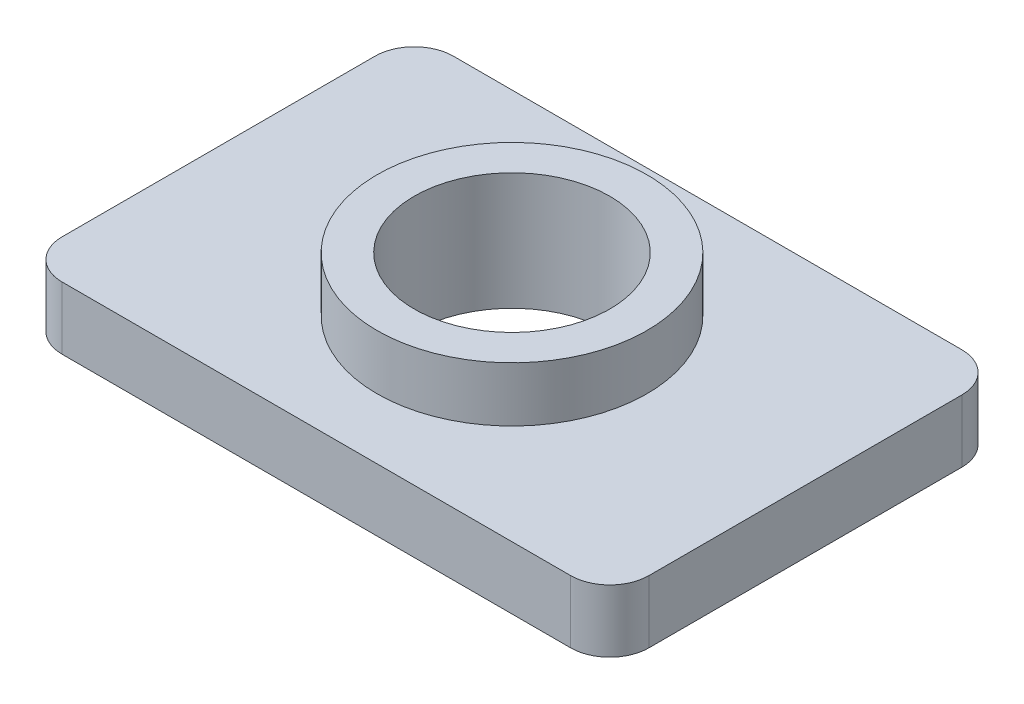
ISO-10303-21;
HEADER;
FILE_DESCRIPTION(('STEP AP214'),'2;1');
FILE_NAME('part.step','',(''),(''),'','','');
FILE_SCHEMA(('AUTOMOTIVE_DESIGN { 1 0 10303 214 1 1 1 1 }'));
ENDSEC;
DATA;
#1=APPLICATION_CONTEXT('core data for automotive mechanical design processes');
#2=APPLICATION_PROTOCOL_DEFINITION('international standard','automotive_design',2000,#1);
#3=PRODUCT_CONTEXT('',#1,'mechanical');
#4=PRODUCT('Part','Part','',(#3));
#5=PRODUCT_RELATED_PRODUCT_CATEGORY('part','',(#4));
#6=PRODUCT_DEFINITION_FORMATION('','',#4);
#7=PRODUCT_DEFINITION_CONTEXT('part definition',#1,'design');
#8=PRODUCT_DEFINITION('design','',#6,#7);
#9=PRODUCT_DEFINITION_SHAPE('','',#8);
#10=(LENGTH_UNIT() NAMED_UNIT(*) SI_UNIT(.MILLI.,.METRE.));
#11=(NAMED_UNIT(*) PLANE_ANGLE_UNIT() SI_UNIT($,.RADIAN.));
#12=(NAMED_UNIT(*) SI_UNIT($,.STERADIAN.) SOLID_ANGLE_UNIT());
#13=UNCERTAINTY_MEASURE_WITH_UNIT(LENGTH_MEASURE(1.E-05),#10,'distance_accuracy_value','');
#14=(GEOMETRIC_REPRESENTATION_CONTEXT(3) GLOBAL_UNCERTAINTY_ASSIGNED_CONTEXT((#13)) GLOBAL_UNIT_ASSIGNED_CONTEXT((#10,
#11,#12)) REPRESENTATION_CONTEXT('',''));
#15=CARTESIAN_POINT('',(0.,0.,0.));
#16=DIRECTION('',(0.,0.,1.));
#17=DIRECTION('',(1.,0.,0.));
#18=AXIS2_PLACEMENT_3D('',#15,#16,#17);
#19=CARTESIAN_POINT('',(0.,1.6,0.));
#20=DIRECTION('',(0.,1.,0.));
#21=DIRECTION('',(0.,0.,1.));
#22=AXIS2_PLACEMENT_3D('',#19,#20,#21);
#23=CYLINDRICAL_SURFACE('',#22,3.45);
#24=CARTESIAN_POINT('',(0.,3.,0.));
#25=DIRECTION('',(0.,1.,0.));
#26=DIRECTION('',(0.,0.,1.));
#27=AXIS2_PLACEMENT_3D('',#24,#25,#26);
#28=CIRCLE('',#27,3.45);
#29=CARTESIAN_POINT('',(0.,3.,3.45));
#30=VERTEX_POINT('',#29);
#31=EDGE_CURVE('E98',#30,#30,#28,.T.);
#32=ORIENTED_EDGE('',*,*,#31,.F.);
#33=EDGE_LOOP('',(#32));
#34=FACE_BOUND('',#33,.T.);
#35=CARTESIAN_POINT('',(0.,1.6,0.));
#36=DIRECTION('',(0.,1.,0.));
#37=DIRECTION('',(0.,0.,1.));
#38=AXIS2_PLACEMENT_3D('',#35,#36,#37);
#39=CIRCLE('',#38,3.45);
#40=CARTESIAN_POINT('',(0.,1.6,3.45));
#41=VERTEX_POINT('',#40);
#42=EDGE_CURVE('E19',#41,#41,#39,.F.);
#43=ORIENTED_EDGE('',*,*,#42,.F.);
#44=EDGE_LOOP('',(#43));
#45=FACE_BOUND('',#44,.T.);
#46=ADVANCED_FACE('F16',(#34,#45),#23,.T.);
#47=CARTESIAN_POINT('',(0.,1.6,0.));
#48=DIRECTION('',(0.,1.,0.));
#49=DIRECTION('',(0.,0.,1.));
#50=AXIS2_PLACEMENT_3D('',#47,#48,#49);
#51=PLANE('',#50);
#52=ORIENTED_EDGE('',*,*,#42,.T.);
#53=EDGE_LOOP('',(#52));
#54=FACE_BOUND('',#53,.T.);
#55=DIRECTION('',(1.,0.,0.));
#56=VECTOR('',#55,1.);
#57=CARTESIAN_POINT('',(-7.5,1.6,5.));
#58=LINE('',#57,#56);
#59=CARTESIAN_POINT('',(6.5,1.6,5.));
#60=VERTEX_POINT('',#59);
#61=CARTESIAN_POINT('',(-6.5,1.6,5.));
#62=VERTEX_POINT('',#61);
#63=EDGE_CURVE('E94',#60,#62,#58,.F.);
#64=ORIENTED_EDGE('',*,*,#63,.F.);
#65=CARTESIAN_POINT('',(6.5,1.6,4.));
#66=DIRECTION('',(0.,-1.,0.));
#67=DIRECTION('',(0.,0.,-1.));
#68=AXIS2_PLACEMENT_3D('',#65,#66,#67);
#69=CIRCLE('',#68,1.);
#70=CARTESIAN_POINT('',(7.5,1.6,4.));
#71=VERTEX_POINT('',#70);
#72=EDGE_CURVE('E88',#71,#60,#69,.T.);
#73=ORIENTED_EDGE('',*,*,#72,.F.);
#74=DIRECTION('',(0.,0.,-1.));
#75=VECTOR('',#74,1.);
#76=CARTESIAN_POINT('',(7.5,1.6,5.));
#77=LINE('',#76,#75);
#78=CARTESIAN_POINT('',(7.5,1.6,-4.));
#79=VERTEX_POINT('',#78);
#80=EDGE_CURVE('E78',#79,#71,#77,.F.);
#81=ORIENTED_EDGE('',*,*,#80,.F.);
#82=CARTESIAN_POINT('',(6.5,1.6,-4.));
#83=DIRECTION('',(0.,-1.,0.));
#84=DIRECTION('',(0.,0.,-1.));
#85=AXIS2_PLACEMENT_3D('',#82,#83,#84);
#86=CIRCLE('',#85,1.);
#87=CARTESIAN_POINT('',(6.5,1.6,-5.));
#88=VERTEX_POINT('',#87);
#89=EDGE_CURVE('E103',#88,#79,#86,.T.);
#90=ORIENTED_EDGE('',*,*,#89,.F.);
#91=DIRECTION('',(-1.,0.,0.));
#92=VECTOR('',#91,1.);
#93=CARTESIAN_POINT('',(7.5,1.6,-5.));
#94=LINE('',#93,#92);
#95=CARTESIAN_POINT('',(-6.5,1.6,-5.));
#96=VERTEX_POINT('',#95);
#97=EDGE_CURVE('E115',#96,#88,#94,.F.);
#98=ORIENTED_EDGE('',*,*,#97,.F.);
#99=CARTESIAN_POINT('',(-6.5,1.6,-4.));
#100=DIRECTION('',(0.,-1.,0.));
#101=DIRECTION('',(0.,0.,-1.));
#102=AXIS2_PLACEMENT_3D('',#99,#100,#101);
#103=CIRCLE('',#102,1.);
#104=CARTESIAN_POINT('',(-7.5,1.6,-4.));
#105=VERTEX_POINT('',#104);
#106=EDGE_CURVE('E137',#105,#96,#103,.T.);
#107=ORIENTED_EDGE('',*,*,#106,.F.);
#108=DIRECTION('',(0.,0.,1.));
#109=VECTOR('',#108,1.);
#110=CARTESIAN_POINT('',(-7.5,1.6,-5.));
#111=LINE('',#110,#109);
#112=CARTESIAN_POINT('',(-7.5,1.6,4.));
#113=VERTEX_POINT('',#112);
#114=EDGE_CURVE('E111',#113,#105,#111,.F.);
#115=ORIENTED_EDGE('',*,*,#114,.F.);
#116=CARTESIAN_POINT('',(-6.5,1.6,4.));
#117=DIRECTION('',(0.,-1.,0.));
#118=DIRECTION('',(0.,0.,-1.));
#119=AXIS2_PLACEMENT_3D('',#116,#117,#118);
#120=CIRCLE('',#119,1.);
#121=EDGE_CURVE('E135',#62,#113,#120,.T.);
#122=ORIENTED_EDGE('',*,*,#121,.F.);
#123=EDGE_LOOP('',(#64,#73,#81,#90,#98,#107,#115,#122));
#124=FACE_BOUND('',#123,.T.);
#125=ADVANCED_FACE('F92',(#54,#124),#51,.T.);
#126=CARTESIAN_POINT('',(0.,3.,0.));
#127=DIRECTION('',(0.,1.,0.));
#128=DIRECTION('',(0.,0.,1.));
#129=AXIS2_PLACEMENT_3D('',#126,#127,#128);
#130=PLANE('',#129);
#131=CARTESIAN_POINT('',(0.,3.,0.));
#132=DIRECTION('',(0.,-1.,0.));
#133=DIRECTION('',(0.,0.,-1.));
#134=AXIS2_PLACEMENT_3D('',#131,#132,#133);
#135=CIRCLE('',#134,2.5);
#136=CARTESIAN_POINT('',(0.,3.,-2.5));
#137=VERTEX_POINT('',#136);
#138=EDGE_CURVE('E131',#137,#137,#135,.T.);
#139=ORIENTED_EDGE('',*,*,#138,.T.);
#140=EDGE_LOOP('',(#139));
#141=FACE_BOUND('',#140,.T.);
#142=ORIENTED_EDGE('',*,*,#31,.T.);
#143=EDGE_LOOP('',(#142));
#144=FACE_BOUND('',#143,.T.);
#145=ADVANCED_FACE('F151',(#141,#144),#130,.T.);
#146=CARTESIAN_POINT('',(6.5,3.68576,4.));
#147=DIRECTION('',(0.,-1.,0.));
#148=DIRECTION('',(0.,0.,-1.));
#149=AXIS2_PLACEMENT_3D('',#146,#147,#148);
#150=CYLINDRICAL_SURFACE('',#149,1.);
#151=DIRECTION('',(0.,1.,0.));
#152=VECTOR('',#151,1.);
#153=CARTESIAN_POINT('',(6.5,0.,5.));
#154=LINE('',#153,#152);
#155=CARTESIAN_POINT('',(6.5,0.,5.));
#156=VERTEX_POINT('',#155);
#157=EDGE_CURVE('E134',#156,#60,#154,.T.);
#158=ORIENTED_EDGE('',*,*,#157,.F.);
#159=CARTESIAN_POINT('',(6.5,0.,4.));
#160=DIRECTION('',(0.,-1.,0.));
#161=DIRECTION('',(0.,0.,-1.));
#162=AXIS2_PLACEMENT_3D('',#159,#160,#161);
#163=CIRCLE('',#162,1.);
#164=CARTESIAN_POINT('',(7.5,0.,4.));
#165=VERTEX_POINT('',#164);
#166=EDGE_CURVE('E102',#156,#165,#163,.F.);
#167=ORIENTED_EDGE('',*,*,#166,.T.);
#168=DIRECTION('',(0.,1.,0.));
#169=VECTOR('',#168,1.);
#170=CARTESIAN_POINT('',(7.5,0.,4.));
#171=LINE('',#170,#169);
#172=EDGE_CURVE('E83',#71,#165,#171,.F.);
#173=ORIENTED_EDGE('',*,*,#172,.F.);
#174=ORIENTED_EDGE('',*,*,#72,.T.);
#175=EDGE_LOOP('',(#158,#167,#173,#174));
#176=FACE_BOUND('',#175,.T.);
#177=ADVANCED_FACE('F101',(#176),#150,.T.);
#178=CARTESIAN_POINT('',(7.5,0.,5.));
#179=DIRECTION('',(1.,0.,0.));
#180=DIRECTION('',(0.,0.,-1.));
#181=AXIS2_PLACEMENT_3D('',#178,#179,#180);
#182=PLANE('',#181);
#183=ORIENTED_EDGE('',*,*,#80,.T.);
#184=ORIENTED_EDGE('',*,*,#172,.T.);
#185=DIRECTION('',(0.,0.,1.));
#186=VECTOR('',#185,1.);
#187=CARTESIAN_POINT('',(7.5,0.,0.));
#188=LINE('',#187,#186);
#189=CARTESIAN_POINT('',(7.5,0.,-4.));
#190=VERTEX_POINT('',#189);
#191=EDGE_CURVE('E129',#165,#190,#188,.F.);
#192=ORIENTED_EDGE('',*,*,#191,.T.);
#193=DIRECTION('',(0.,-1.,0.));
#194=VECTOR('',#193,1.);
#195=CARTESIAN_POINT('',(7.5,3.68576,-4.));
#196=LINE('',#195,#194);
#197=EDGE_CURVE('E85',#79,#190,#196,.T.);
#198=ORIENTED_EDGE('',*,*,#197,.F.);
#199=EDGE_LOOP('',(#183,#184,#192,#198));
#200=FACE_BOUND('',#199,.T.);
#201=ADVANCED_FACE('F80',(#200),#182,.T.);
#202=CARTESIAN_POINT('',(6.5,3.68576,-4.));
#203=DIRECTION('',(0.,-1.,0.));
#204=DIRECTION('',(0.,0.,-1.));
#205=AXIS2_PLACEMENT_3D('',#202,#203,#204);
#206=CYLINDRICAL_SURFACE('',#205,1.);
#207=ORIENTED_EDGE('',*,*,#197,.T.);
#208=CARTESIAN_POINT('',(6.5,0.,-4.));
#209=DIRECTION('',(0.,-1.,0.));
#210=DIRECTION('',(0.,0.,-1.));
#211=AXIS2_PLACEMENT_3D('',#208,#209,#210);
#212=CIRCLE('',#211,1.);
#213=CARTESIAN_POINT('',(6.5,0.,-5.));
#214=VERTEX_POINT('',#213);
#215=EDGE_CURVE('E126',#190,#214,#212,.F.);
#216=ORIENTED_EDGE('',*,*,#215,.T.);
#217=DIRECTION('',(0.,1.,0.));
#218=VECTOR('',#217,1.);
#219=CARTESIAN_POINT('',(6.5,0.,-5.));
#220=LINE('',#219,#218);
#221=EDGE_CURVE('E116',#88,#214,#220,.F.);
#222=ORIENTED_EDGE('',*,*,#221,.F.);
#223=ORIENTED_EDGE('',*,*,#89,.T.);
#224=EDGE_LOOP('',(#207,#216,#222,#223));
#225=FACE_BOUND('',#224,.T.);
#226=ADVANCED_FACE('F183',(#225),#206,.T.);
#227=CARTESIAN_POINT('',(7.5,0.,-5.));
#228=DIRECTION('',(0.,0.,-1.));
#229=DIRECTION('',(-1.,0.,0.));
#230=AXIS2_PLACEMENT_3D('',#227,#228,#229);
#231=PLANE('',#230);
#232=ORIENTED_EDGE('',*,*,#97,.T.);
#233=ORIENTED_EDGE('',*,*,#221,.T.);
#234=DIRECTION('',(1.,0.,0.));
#235=VECTOR('',#234,1.);
#236=CARTESIAN_POINT('',(0.,0.,-5.));
#237=LINE('',#236,#235);
#238=CARTESIAN_POINT('',(-6.5,0.,-5.));
#239=VERTEX_POINT('',#238);
#240=EDGE_CURVE('E125',#214,#239,#237,.F.);
#241=ORIENTED_EDGE('',*,*,#240,.T.);
#242=DIRECTION('',(0.,-1.,0.));
#243=VECTOR('',#242,1.);
#244=CARTESIAN_POINT('',(-6.5,3.68576,-5.));
#245=LINE('',#244,#243);
#246=EDGE_CURVE('E114',#96,#239,#245,.T.);
#247=ORIENTED_EDGE('',*,*,#246,.F.);
#248=EDGE_LOOP('',(#232,#233,#241,#247));
#249=FACE_BOUND('',#248,.T.);
#250=ADVANCED_FACE('F179',(#249),#231,.T.);
#251=CARTESIAN_POINT('',(-6.5,3.68576,-4.));
#252=DIRECTION('',(0.,-1.,0.));
#253=DIRECTION('',(0.,0.,-1.));
#254=AXIS2_PLACEMENT_3D('',#251,#252,#253);
#255=CYLINDRICAL_SURFACE('',#254,1.);
#256=ORIENTED_EDGE('',*,*,#246,.T.);
#257=CARTESIAN_POINT('',(-6.5,0.,-4.));
#258=DIRECTION('',(0.,-1.,0.));
#259=DIRECTION('',(0.,0.,-1.));
#260=AXIS2_PLACEMENT_3D('',#257,#258,#259);
#261=CIRCLE('',#260,1.);
#262=CARTESIAN_POINT('',(-7.5,0.,-4.));
#263=VERTEX_POINT('',#262);
#264=EDGE_CURVE('E122',#239,#263,#261,.F.);
#265=ORIENTED_EDGE('',*,*,#264,.T.);
#266=DIRECTION('',(0.,1.,0.));
#267=VECTOR('',#266,1.);
#268=CARTESIAN_POINT('',(-7.5,0.,-4.));
#269=LINE('',#268,#267);
#270=EDGE_CURVE('E113',#105,#263,#269,.F.);
#271=ORIENTED_EDGE('',*,*,#270,.F.);
#272=ORIENTED_EDGE('',*,*,#106,.T.);
#273=EDGE_LOOP('',(#256,#265,#271,#272));
#274=FACE_BOUND('',#273,.T.);
#275=ADVANCED_FACE('F175',(#274),#255,.T.);
#276=CARTESIAN_POINT('',(-7.5,0.,-5.));
#277=DIRECTION('',(-1.,0.,0.));
#278=DIRECTION('',(0.,0.,1.));
#279=AXIS2_PLACEMENT_3D('',#276,#277,#278);
#280=PLANE('',#279);
#281=ORIENTED_EDGE('',*,*,#114,.T.);
#282=ORIENTED_EDGE('',*,*,#270,.T.);
#283=DIRECTION('',(0.,0.,1.));
#284=VECTOR('',#283,1.);
#285=CARTESIAN_POINT('',(-7.5,0.,0.));
#286=LINE('',#285,#284);
#287=CARTESIAN_POINT('',(-7.5,0.,4.));
#288=VERTEX_POINT('',#287);
#289=EDGE_CURVE('E121',#263,#288,#286,.T.);
#290=ORIENTED_EDGE('',*,*,#289,.T.);
#291=DIRECTION('',(0.,-1.,0.));
#292=VECTOR('',#291,1.);
#293=CARTESIAN_POINT('',(-7.5,3.68576,4.));
#294=LINE('',#293,#292);
#295=EDGE_CURVE('E110',#113,#288,#294,.T.);
#296=ORIENTED_EDGE('',*,*,#295,.F.);
#297=EDGE_LOOP('',(#281,#282,#290,#296));
#298=FACE_BOUND('',#297,.T.);
#299=ADVANCED_FACE('F171',(#298),#280,.T.);
#300=CARTESIAN_POINT('',(-6.5,3.68576,4.));
#301=DIRECTION('',(0.,-1.,0.));
#302=DIRECTION('',(0.,0.,-1.));
#303=AXIS2_PLACEMENT_3D('',#300,#301,#302);
#304=CYLINDRICAL_SURFACE('',#303,1.);
#305=ORIENTED_EDGE('',*,*,#295,.T.);
#306=CARTESIAN_POINT('',(-6.5,0.,4.));
#307=DIRECTION('',(0.,-1.,0.));
#308=DIRECTION('',(0.,0.,-1.));
#309=AXIS2_PLACEMENT_3D('',#306,#307,#308);
#310=CIRCLE('',#309,1.);
#311=CARTESIAN_POINT('',(-6.5,0.,5.));
#312=VERTEX_POINT('',#311);
#313=EDGE_CURVE('E118',#288,#312,#310,.F.);
#314=ORIENTED_EDGE('',*,*,#313,.T.);
#315=DIRECTION('',(0.,1.,0.));
#316=VECTOR('',#315,1.);
#317=CARTESIAN_POINT('',(-6.5,0.,5.));
#318=LINE('',#317,#316);
#319=EDGE_CURVE('E34',#62,#312,#318,.F.);
#320=ORIENTED_EDGE('',*,*,#319,.F.);
#321=ORIENTED_EDGE('',*,*,#121,.T.);
#322=EDGE_LOOP('',(#305,#314,#320,#321));
#323=FACE_BOUND('',#322,.T.);
#324=ADVANCED_FACE('F168',(#323),#304,.T.);
#325=CARTESIAN_POINT('',(-7.5,0.,5.));
#326=DIRECTION('',(0.,0.,1.));
#327=DIRECTION('',(1.,0.,0.));
#328=AXIS2_PLACEMENT_3D('',#325,#326,#327);
#329=PLANE('',#328);
#330=DIRECTION('',(1.,0.,0.));
#331=VECTOR('',#330,1.);
#332=CARTESIAN_POINT('',(0.,0.,5.));
#333=LINE('',#332,#331);
#334=EDGE_CURVE('E25',#312,#156,#333,.T.);
#335=ORIENTED_EDGE('',*,*,#334,.T.);
#336=ORIENTED_EDGE('',*,*,#157,.T.);
#337=ORIENTED_EDGE('',*,*,#63,.T.);
#338=ORIENTED_EDGE('',*,*,#319,.T.);
#339=EDGE_LOOP('',(#335,#336,#337,#338));
#340=FACE_BOUND('',#339,.T.);
#341=ADVANCED_FACE('F160',(#340),#329,.T.);
#342=CARTESIAN_POINT('',(0.,3.,0.));
#343=DIRECTION('',(0.,-1.,0.));
#344=DIRECTION('',(0.,0.,-1.));
#345=AXIS2_PLACEMENT_3D('',#342,#343,#344);
#346=CYLINDRICAL_SURFACE('',#345,2.5);
#347=ORIENTED_EDGE('',*,*,#138,.F.);
#348=EDGE_LOOP('',(#347));
#349=FACE_BOUND('',#348,.T.);
#350=CARTESIAN_POINT('',(0.,0.,0.));
#351=DIRECTION('',(0.,-1.,0.));
#352=DIRECTION('',(0.,0.,-1.));
#353=AXIS2_PLACEMENT_3D('',#350,#351,#352);
#354=CIRCLE('',#353,2.5);
#355=CARTESIAN_POINT('',(0.,0.,-2.5));
#356=VERTEX_POINT('',#355);
#357=EDGE_CURVE('E10',#356,#356,#354,.T.);
#358=ORIENTED_EDGE('',*,*,#357,.T.);
#359=EDGE_LOOP('',(#358));
#360=FACE_BOUND('',#359,.T.);
#361=ADVANCED_FACE('F154',(#349,#360),#346,.F.);
#362=CARTESIAN_POINT('',(0.,0.,0.));
#363=DIRECTION('',(0.,1.,0.));
#364=DIRECTION('',(0.,0.,1.));
#365=AXIS2_PLACEMENT_3D('',#362,#363,#364);
#366=PLANE('',#365);
#367=ORIENTED_EDGE('',*,*,#357,.F.);
#368=EDGE_LOOP('',(#367));
#369=FACE_BOUND('',#368,.T.);
#370=ORIENTED_EDGE('',*,*,#313,.F.);
#371=ORIENTED_EDGE('',*,*,#289,.F.);
#372=ORIENTED_EDGE('',*,*,#264,.F.);
#373=ORIENTED_EDGE('',*,*,#240,.F.);
#374=ORIENTED_EDGE('',*,*,#215,.F.);
#375=ORIENTED_EDGE('',*,*,#191,.F.);
#376=ORIENTED_EDGE('',*,*,#166,.F.);
#377=ORIENTED_EDGE('',*,*,#334,.F.);
#378=EDGE_LOOP('',(#370,#371,#372,#373,#374,#375,#376,#377));
#379=FACE_BOUND('',#378,.T.);
#380=ADVANCED_FACE('F152',(#369,#379),#366,.F.);
#381=CLOSED_SHELL('',(#46,#125,#145,#177,#201,#226,#250,#275,#299,#324,#341,#361,#380));
#382=MANIFOLD_SOLID_BREP('B1',#381);
#383=ADVANCED_BREP_SHAPE_REPRESENTATION('',(#18,#382),#14);
#384=SHAPE_DEFINITION_REPRESENTATION(#9,#383);
ENDSEC;
END-ISO-10303-21;
